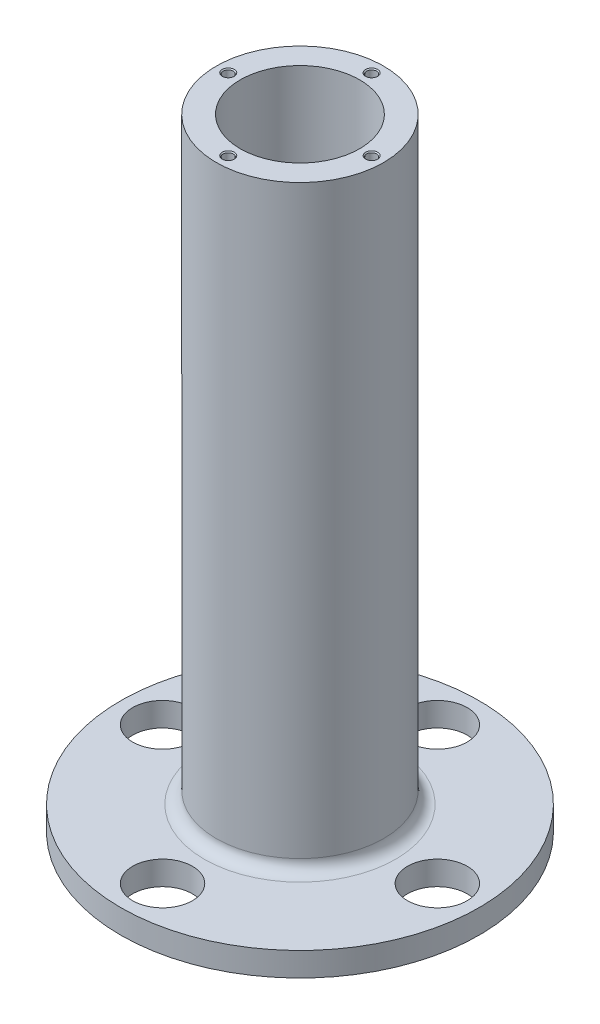
ISO-10303-21;
HEADER;
FILE_DESCRIPTION(('STEP AP214'),'2;1');
FILE_NAME('part.step','',(''),(''),'','','');
FILE_SCHEMA(('AUTOMOTIVE_DESIGN { 1 0 10303 214 1 1 1 1 }'));
ENDSEC;
DATA;
#1=APPLICATION_CONTEXT('core data for automotive mechanical design processes');
#2=APPLICATION_PROTOCOL_DEFINITION('international standard','automotive_design',2000,#1);
#3=PRODUCT_CONTEXT('',#1,'mechanical');
#4=PRODUCT('Part','Part','',(#3));
#5=PRODUCT_RELATED_PRODUCT_CATEGORY('part','',(#4));
#6=PRODUCT_DEFINITION_FORMATION('','',#4);
#7=PRODUCT_DEFINITION_CONTEXT('part definition',#1,'design');
#8=PRODUCT_DEFINITION('design','',#6,#7);
#9=PRODUCT_DEFINITION_SHAPE('','',#8);
#10=(LENGTH_UNIT() NAMED_UNIT(*) SI_UNIT(.MILLI.,.METRE.));
#11=(NAMED_UNIT(*) PLANE_ANGLE_UNIT() SI_UNIT($,.RADIAN.));
#12=(NAMED_UNIT(*) SI_UNIT($,.STERADIAN.) SOLID_ANGLE_UNIT());
#13=UNCERTAINTY_MEASURE_WITH_UNIT(LENGTH_MEASURE(1.E-05),#10,'distance_accuracy_value','');
#14=(GEOMETRIC_REPRESENTATION_CONTEXT(3) GLOBAL_UNCERTAINTY_ASSIGNED_CONTEXT((#13)) GLOBAL_UNIT_ASSIGNED_CONTEXT((#10,
#11,#12)) REPRESENTATION_CONTEXT('',''));
#15=CARTESIAN_POINT('',(0.,0.,0.));
#16=DIRECTION('',(0.,0.,1.));
#17=DIRECTION('',(1.,0.,0.));
#18=AXIS2_PLACEMENT_3D('',#15,#16,#17);
#19=CARTESIAN_POINT('',(0.,10.,0.));
#20=DIRECTION('',(0.,-1.,0.));
#21=DIRECTION('',(0.,0.,-1.));
#22=AXIS2_PLACEMENT_3D('',#19,#20,#21);
#23=CYLINDRICAL_SURFACE('',#22,75.);
#24=CARTESIAN_POINT('',(0.,10.,0.));
#25=DIRECTION('',(0.,1.,0.));
#26=DIRECTION('',(0.,0.,1.));
#27=AXIS2_PLACEMENT_3D('',#24,#25,#26);
#28=CIRCLE('',#27,75.);
#29=CARTESIAN_POINT('',(0.,10.,75.));
#30=VERTEX_POINT('',#29);
#31=EDGE_CURVE('E147',#30,#30,#28,.T.);
#32=ORIENTED_EDGE('',*,*,#31,.F.);
#33=EDGE_LOOP('',(#32));
#34=FACE_BOUND('',#33,.T.);
#35=CARTESIAN_POINT('',(0.,0.,0.));
#36=DIRECTION('',(0.,1.,0.));
#37=DIRECTION('',(0.,0.,1.));
#38=AXIS2_PLACEMENT_3D('',#35,#36,#37);
#39=CIRCLE('',#38,75.);
#40=CARTESIAN_POINT('',(0.,0.,75.));
#41=VERTEX_POINT('',#40);
#42=EDGE_CURVE('E146',#41,#41,#39,.T.);
#43=ORIENTED_EDGE('',*,*,#42,.T.);
#44=EDGE_LOOP('',(#43));
#45=FACE_BOUND('',#44,.T.);
#46=ADVANCED_FACE('F51',(#34,#45),#23,.T.);
#47=CARTESIAN_POINT('',(0.,10.,0.));
#48=DIRECTION('',(0.,1.,0.));
#49=DIRECTION('',(0.,0.,1.));
#50=AXIS2_PLACEMENT_3D('',#47,#48,#49);
#51=PLANE('',#50);
#52=CARTESIAN_POINT('',(0.,10.,0.));
#53=DIRECTION('',(0.,1.,0.));
#54=DIRECTION('',(0.,0.,1.));
#55=AXIS2_PLACEMENT_3D('',#52,#53,#54);
#56=CIRCLE('',#55,40.);
#57=CARTESIAN_POINT('',(0.,10.,40.));
#58=VERTEX_POINT('',#57);
#59=EDGE_CURVE('E12',#58,#58,#56,.F.);
#60=ORIENTED_EDGE('',*,*,#59,.T.);
#61=EDGE_LOOP('',(#60));
#62=FACE_BOUND('',#61,.T.);
#63=CARTESIAN_POINT('',(57.5,10.,0.));
#64=DIRECTION('',(0.,1.,0.));
#65=DIRECTION('',(0.,0.,1.));
#66=AXIS2_PLACEMENT_3D('',#63,#64,#65);
#67=CIRCLE('',#66,12.5);
#68=CARTESIAN_POINT('',(57.5,10.,12.5));
#69=VERTEX_POINT('',#68);
#70=EDGE_CURVE('E116',#69,#69,#67,.T.);
#71=ORIENTED_EDGE('',*,*,#70,.F.);
#72=EDGE_LOOP('',(#71));
#73=FACE_BOUND('',#72,.T.);
#74=CARTESIAN_POINT('',(-2.0076017698348E-13,10.,57.5));
#75=DIRECTION('',(0.,1.,0.));
#76=DIRECTION('',(0.,0.,1.));
#77=AXIS2_PLACEMENT_3D('',#74,#75,#76);
#78=CIRCLE('',#77,12.5);
#79=CARTESIAN_POINT('',(-2.0076017698348E-13,10.,70.));
#80=VERTEX_POINT('',#79);
#81=EDGE_CURVE('E122',#80,#80,#78,.T.);
#82=ORIENTED_EDGE('',*,*,#81,.F.);
#83=EDGE_LOOP('',(#82));
#84=FACE_BOUND('',#83,.T.);
#85=CARTESIAN_POINT('',(-57.5,10.,-4.0152035396696E-13));
#86=DIRECTION('',(0.,1.,0.));
#87=DIRECTION('',(0.,0.,1.));
#88=AXIS2_PLACEMENT_3D('',#85,#86,#87);
#89=CIRCLE('',#88,12.5);
#90=CARTESIAN_POINT('',(-57.5,10.,12.4999999999996));
#91=VERTEX_POINT('',#90);
#92=EDGE_CURVE('E128',#91,#91,#89,.T.);
#93=ORIENTED_EDGE('',*,*,#92,.F.);
#94=EDGE_LOOP('',(#93));
#95=FACE_BOUND('',#94,.T.);
#96=CARTESIAN_POINT('',(6.0228053095044E-13,10.,-57.5));
#97=DIRECTION('',(0.,1.,0.));
#98=DIRECTION('',(0.,0.,1.));
#99=AXIS2_PLACEMENT_3D('',#96,#97,#98);
#100=CIRCLE('',#99,12.5);
#101=CARTESIAN_POINT('',(6.0228053095044E-13,10.,-45.));
#102=VERTEX_POINT('',#101);
#103=EDGE_CURVE('E134',#102,#102,#100,.T.);
#104=ORIENTED_EDGE('',*,*,#103,.F.);
#105=EDGE_LOOP('',(#104));
#106=FACE_BOUND('',#105,.T.);
#107=ORIENTED_EDGE('',*,*,#31,.T.);
#108=EDGE_LOOP('',(#107));
#109=FACE_BOUND('',#108,.T.);
#110=ADVANCED_FACE('F171',(#62,#73,#84,#95,#106,#109),#51,.T.);
#111=CARTESIAN_POINT('',(0.,0.,0.));
#112=DIRECTION('',(0.,1.,0.));
#113=DIRECTION('',(0.,0.,1.));
#114=AXIS2_PLACEMENT_3D('',#111,#112,#113);
#115=PLANE('',#114);
#116=CARTESIAN_POINT('',(57.5,0.,0.));
#117=DIRECTION('',(0.,1.,0.));
#118=DIRECTION('',(0.,0.,1.));
#119=AXIS2_PLACEMENT_3D('',#116,#117,#118);
#120=CIRCLE('',#119,12.5);
#121=CARTESIAN_POINT('',(57.5,0.,12.5));
#122=VERTEX_POINT('',#121);
#123=EDGE_CURVE('E119',#122,#122,#120,.T.);
#124=ORIENTED_EDGE('',*,*,#123,.T.);
#125=EDGE_LOOP('',(#124));
#126=FACE_BOUND('',#125,.T.);
#127=CARTESIAN_POINT('',(-2.0076017698348E-13,0.,57.5));
#128=DIRECTION('',(0.,1.,0.));
#129=DIRECTION('',(0.,0.,1.));
#130=AXIS2_PLACEMENT_3D('',#127,#128,#129);
#131=CIRCLE('',#130,12.5);
#132=CARTESIAN_POINT('',(-2.0076017698348E-13,0.,70.));
#133=VERTEX_POINT('',#132);
#134=EDGE_CURVE('E125',#133,#133,#131,.T.);
#135=ORIENTED_EDGE('',*,*,#134,.T.);
#136=EDGE_LOOP('',(#135));
#137=FACE_BOUND('',#136,.T.);
#138=CARTESIAN_POINT('',(-57.5,0.,-4.0152035396696E-13));
#139=DIRECTION('',(0.,1.,0.));
#140=DIRECTION('',(0.,0.,1.));
#141=AXIS2_PLACEMENT_3D('',#138,#139,#140);
#142=CIRCLE('',#141,12.5);
#143=CARTESIAN_POINT('',(-57.5,0.,12.4999999999996));
#144=VERTEX_POINT('',#143);
#145=EDGE_CURVE('E131',#144,#144,#142,.T.);
#146=ORIENTED_EDGE('',*,*,#145,.T.);
#147=EDGE_LOOP('',(#146));
#148=FACE_BOUND('',#147,.T.);
#149=CARTESIAN_POINT('',(6.0228053095044E-13,0.,-57.5));
#150=DIRECTION('',(0.,1.,0.));
#151=DIRECTION('',(0.,0.,1.));
#152=AXIS2_PLACEMENT_3D('',#149,#150,#151);
#153=CIRCLE('',#152,12.5);
#154=CARTESIAN_POINT('',(6.0228053095044E-13,0.,-45.));
#155=VERTEX_POINT('',#154);
#156=EDGE_CURVE('E137',#155,#155,#153,.T.);
#157=ORIENTED_EDGE('',*,*,#156,.T.);
#158=EDGE_LOOP('',(#157));
#159=FACE_BOUND('',#158,.T.);
#160=ORIENTED_EDGE('',*,*,#42,.F.);
#161=EDGE_LOOP('',(#160));
#162=FACE_BOUND('',#161,.T.);
#163=ADVANCED_FACE('F177',(#126,#137,#148,#159,#162),#115,.F.);
#164=CARTESIAN_POINT('',(0.,260.,0.));
#165=DIRECTION('',(0.,1.,0.));
#166=DIRECTION('',(0.,0.,1.));
#167=AXIS2_PLACEMENT_3D('',#164,#165,#166);
#168=PLANE('',#167);
#169=CARTESIAN_POINT('',(-30.,260.,0.));
#170=DIRECTION('',(0.,1.,0.));
#171=DIRECTION('',(0.,0.,1.));
#172=AXIS2_PLACEMENT_3D('',#169,#170,#171);
#173=CIRCLE('',#172,2.525);
#174=CARTESIAN_POINT('',(-30.,260.,2.525));
#175=VERTEX_POINT('',#174);
#176=EDGE_CURVE('E89',#175,#175,#173,.T.);
#177=ORIENTED_EDGE('',*,*,#176,.F.);
#178=EDGE_LOOP('',(#177));
#179=FACE_BOUND('',#178,.T.);
#180=CARTESIAN_POINT('',(1.04744440165294E-13,260.,-30.));
#181=DIRECTION('',(0.,1.,0.));
#182=DIRECTION('',(0.,0.,1.));
#183=AXIS2_PLACEMENT_3D('',#180,#181,#182);
#184=CIRCLE('',#183,2.525);
#185=CARTESIAN_POINT('',(1.04744440165294E-13,260.,-27.475));
#186=VERTEX_POINT('',#185);
#187=EDGE_CURVE('E82',#186,#186,#184,.T.);
#188=ORIENTED_EDGE('',*,*,#187,.F.);
#189=EDGE_LOOP('',(#188));
#190=FACE_BOUND('',#189,.T.);
#191=CARTESIAN_POINT('',(30.,260.,2.09488880330588E-13));
#192=DIRECTION('',(0.,1.,0.));
#193=DIRECTION('',(0.,0.,1.));
#194=AXIS2_PLACEMENT_3D('',#191,#192,#193);
#195=CIRCLE('',#194,2.525);
#196=CARTESIAN_POINT('',(30.,260.,2.52500000000021));
#197=VERTEX_POINT('',#196);
#198=EDGE_CURVE('E98',#197,#197,#195,.T.);
#199=ORIENTED_EDGE('',*,*,#198,.F.);
#200=EDGE_LOOP('',(#199));
#201=FACE_BOUND('',#200,.T.);
#202=CARTESIAN_POINT('',(-3.14233320495882E-13,260.,30.));
#203=DIRECTION('',(0.,1.,0.));
#204=DIRECTION('',(0.,0.,1.));
#205=AXIS2_PLACEMENT_3D('',#202,#203,#204);
#206=CIRCLE('',#205,2.525);
#207=CARTESIAN_POINT('',(-3.14233320495882E-13,260.,32.525));
#208=VERTEX_POINT('',#207);
#209=EDGE_CURVE('E107',#208,#208,#206,.T.);
#210=ORIENTED_EDGE('',*,*,#209,.F.);
#211=EDGE_LOOP('',(#210));
#212=FACE_BOUND('',#211,.T.);
#213=CARTESIAN_POINT('',(0.,260.,0.));
#214=DIRECTION('',(0.,1.,0.));
#215=DIRECTION('',(1.,0.,0.));
#216=AXIS2_PLACEMENT_3D('',#213,#214,#215);
#217=CIRCLE('',#216,35.);
#218=CARTESIAN_POINT('',(35.,260.,0.));
#219=VERTEX_POINT('',#218);
#220=EDGE_CURVE('E143',#219,#219,#217,.T.);
#221=ORIENTED_EDGE('',*,*,#220,.T.);
#222=EDGE_LOOP('',(#221));
#223=FACE_BOUND('',#222,.T.);
#224=CARTESIAN_POINT('',(0.,260.,0.));
#225=DIRECTION('',(0.,1.,0.));
#226=DIRECTION('',(0.,0.,1.));
#227=AXIS2_PLACEMENT_3D('',#224,#225,#226);
#228=CIRCLE('',#227,25.);
#229=CARTESIAN_POINT('',(0.,260.,25.));
#230=VERTEX_POINT('',#229);
#231=EDGE_CURVE('E140',#230,#230,#228,.T.);
#232=ORIENTED_EDGE('',*,*,#231,.F.);
#233=EDGE_LOOP('',(#232));
#234=FACE_BOUND('',#233,.T.);
#235=ADVANCED_FACE('F185',(#179,#190,#201,#212,#223,#234),#168,.T.);
#236=CARTESIAN_POINT('',(0.,260.,0.));
#237=DIRECTION('',(0.,-1.,0.));
#238=DIRECTION('',(0.,0.,-1.));
#239=AXIS2_PLACEMENT_3D('',#236,#237,#238);
#240=CYLINDRICAL_SURFACE('',#239,35.);
#241=CARTESIAN_POINT('',(0.,15.,0.));
#242=DIRECTION('',(0.,1.,0.));
#243=DIRECTION('',(0.,0.,1.));
#244=AXIS2_PLACEMENT_3D('',#241,#242,#243);
#245=CIRCLE('',#244,35.);
#246=CARTESIAN_POINT('',(0.,15.,35.));
#247=VERTEX_POINT('',#246);
#248=EDGE_CURVE('E59',#247,#247,#245,.T.);
#249=ORIENTED_EDGE('',*,*,#248,.T.);
#250=EDGE_LOOP('',(#249));
#251=FACE_BOUND('',#250,.T.);
#252=ORIENTED_EDGE('',*,*,#220,.F.);
#253=EDGE_LOOP('',(#252));
#254=FACE_BOUND('',#253,.T.);
#255=ADVANCED_FACE('F157',(#251,#254),#240,.T.);
#256=CARTESIAN_POINT('',(0.,260.,0.));
#257=DIRECTION('',(0.,-1.,0.));
#258=DIRECTION('',(0.,0.,-1.));
#259=AXIS2_PLACEMENT_3D('',#256,#257,#258);
#260=CYLINDRICAL_SURFACE('',#259,25.);
#261=ORIENTED_EDGE('',*,*,#231,.T.);
#262=EDGE_LOOP('',(#261));
#263=FACE_BOUND('',#262,.T.);
#264=CARTESIAN_POINT('',(0.,10.,0.));
#265=DIRECTION('',(0.,1.,0.));
#266=DIRECTION('',(0.,0.,1.));
#267=AXIS2_PLACEMENT_3D('',#264,#265,#266);
#268=CIRCLE('',#267,25.);
#269=CARTESIAN_POINT('',(0.,10.,25.));
#270=VERTEX_POINT('',#269);
#271=EDGE_CURVE('E150',#270,#270,#268,.F.);
#272=ORIENTED_EDGE('',*,*,#271,.T.);
#273=EDGE_LOOP('',(#272));
#274=FACE_BOUND('',#273,.T.);
#275=ADVANCED_FACE('F189',(#263,#274),#260,.F.);
#276=ORIENTED_EDGE('',*,*,#271,.F.);
#277=EDGE_LOOP('',(#276));
#278=FACE_BOUND('',#277,.T.);
#279=ADVANCED_FACE('F180',(#278),#51,.T.);
#280=CARTESIAN_POINT('',(6.0228053095044E-13,10.,-57.5));
#281=DIRECTION('',(0.,1.,0.));
#282=DIRECTION('',(0.,0.,1.));
#283=AXIS2_PLACEMENT_3D('',#280,#281,#282);
#284=CYLINDRICAL_SURFACE('',#283,12.5);
#285=ORIENTED_EDGE('',*,*,#156,.F.);
#286=EDGE_LOOP('',(#285));
#287=FACE_BOUND('',#286,.T.);
#288=ORIENTED_EDGE('',*,*,#103,.T.);
#289=EDGE_LOOP('',(#288));
#290=FACE_BOUND('',#289,.T.);
#291=ADVANCED_FACE('F195',(#287,#290),#284,.F.);
#292=CARTESIAN_POINT('',(-57.5,10.,-4.0152035396696E-13));
#293=DIRECTION('',(0.,1.,0.));
#294=DIRECTION('',(0.,0.,1.));
#295=AXIS2_PLACEMENT_3D('',#292,#293,#294);
#296=CYLINDRICAL_SURFACE('',#295,12.5);
#297=ORIENTED_EDGE('',*,*,#145,.F.);
#298=EDGE_LOOP('',(#297));
#299=FACE_BOUND('',#298,.T.);
#300=ORIENTED_EDGE('',*,*,#92,.T.);
#301=EDGE_LOOP('',(#300));
#302=FACE_BOUND('',#301,.T.);
#303=ADVANCED_FACE('F198',(#299,#302),#296,.F.);
#304=CARTESIAN_POINT('',(-2.0076017698348E-13,10.,57.5));
#305=DIRECTION('',(0.,1.,0.));
#306=DIRECTION('',(0.,0.,1.));
#307=AXIS2_PLACEMENT_3D('',#304,#305,#306);
#308=CYLINDRICAL_SURFACE('',#307,12.5);
#309=ORIENTED_EDGE('',*,*,#134,.F.);
#310=EDGE_LOOP('',(#309));
#311=FACE_BOUND('',#310,.T.);
#312=ORIENTED_EDGE('',*,*,#81,.T.);
#313=EDGE_LOOP('',(#312));
#314=FACE_BOUND('',#313,.T.);
#315=ADVANCED_FACE('F202',(#311,#314),#308,.F.);
#316=CARTESIAN_POINT('',(57.5,10.,0.));
#317=DIRECTION('',(0.,1.,0.));
#318=DIRECTION('',(0.,0.,1.));
#319=AXIS2_PLACEMENT_3D('',#316,#317,#318);
#320=CYLINDRICAL_SURFACE('',#319,12.5);
#321=ORIENTED_EDGE('',*,*,#123,.F.);
#322=EDGE_LOOP('',(#321));
#323=FACE_BOUND('',#322,.T.);
#324=ORIENTED_EDGE('',*,*,#70,.T.);
#325=EDGE_LOOP('',(#324));
#326=FACE_BOUND('',#325,.T.);
#327=ADVANCED_FACE('F206',(#323,#326),#320,.F.);
#328=CARTESIAN_POINT('',(-3.14233320495882E-13,237.6,30.));
#329=DIRECTION('',(0.,1.,0.));
#330=DIRECTION('',(0.,0.,1.));
#331=AXIS2_PLACEMENT_3D('',#328,#329,#330);
#332=CONICAL_SURFACE('',#331,2.09999999999999,1.02974425867665);
#333=CARTESIAN_POINT('',(-3.20028791810269E-13,236.338192700042,30.));
#334=VERTEX_POINT('',#333);
#335=VERTEX_LOOP('',#334);
#336=FACE_BOUND('',#335,.T.);
#337=CARTESIAN_POINT('',(-3.14233320495882E-13,237.6,30.));
#338=DIRECTION('',(0.,1.,0.));
#339=DIRECTION('',(0.,0.,1.));
#340=AXIS2_PLACEMENT_3D('',#337,#338,#339);
#341=CIRCLE('',#340,2.09999999999999);
#342=CARTESIAN_POINT('',(-3.14233320495882E-13,237.6,32.1));
#343=VERTEX_POINT('',#342);
#344=EDGE_CURVE('E113',#343,#343,#341,.T.);
#345=ORIENTED_EDGE('',*,*,#344,.T.);
#346=EDGE_LOOP('',(#345));
#347=FACE_BOUND('',#346,.T.);
#348=ADVANCED_FACE('F210',(#336,#347),#332,.F.);
#349=CARTESIAN_POINT('',(-3.14233320495882E-13,260.,30.));
#350=DIRECTION('',(0.,1.,0.));
#351=DIRECTION('',(0.,0.,1.));
#352=AXIS2_PLACEMENT_3D('',#349,#350,#351);
#353=CYLINDRICAL_SURFACE('',#352,2.09999999999999);
#354=ORIENTED_EDGE('',*,*,#344,.F.);
#355=EDGE_LOOP('',(#354));
#356=FACE_BOUND('',#355,.T.);
#357=CARTESIAN_POINT('',(-3.14233320495882E-13,259.575,30.));
#358=DIRECTION('',(0.,1.,0.));
#359=DIRECTION('',(0.,0.,1.));
#360=AXIS2_PLACEMENT_3D('',#357,#358,#359);
#361=CIRCLE('',#360,2.1);
#362=CARTESIAN_POINT('',(-3.14233320495882E-13,259.575,32.1));
#363=VERTEX_POINT('',#362);
#364=EDGE_CURVE('E110',#363,#363,#361,.T.);
#365=ORIENTED_EDGE('',*,*,#364,.T.);
#366=EDGE_LOOP('',(#365));
#367=FACE_BOUND('',#366,.T.);
#368=ADVANCED_FACE('F214',(#356,#367),#353,.F.);
#369=CARTESIAN_POINT('',(-3.14233320495882E-13,260.,30.));
#370=DIRECTION('',(0.,1.,0.));
#371=DIRECTION('',(0.,0.,1.));
#372=AXIS2_PLACEMENT_3D('',#369,#370,#371);
#373=CONICAL_SURFACE('',#372,2.525,0.78539816339744);
#374=ORIENTED_EDGE('',*,*,#364,.F.);
#375=EDGE_LOOP('',(#374));
#376=FACE_BOUND('',#375,.T.);
#377=ORIENTED_EDGE('',*,*,#209,.T.);
#378=EDGE_LOOP('',(#377));
#379=FACE_BOUND('',#378,.T.);
#380=ADVANCED_FACE('F217',(#376,#379),#373,.F.);
#381=CARTESIAN_POINT('',(30.,237.6,2.09488880330588E-13));
#382=DIRECTION('',(0.,1.,0.));
#383=DIRECTION('',(0.,0.,1.));
#384=AXIS2_PLACEMENT_3D('',#381,#382,#383);
#385=CONICAL_SURFACE('',#384,2.09999999999998,1.02974425867665);
#386=CARTESIAN_POINT('',(30.,236.338192700042,2.09488880330588E-13));
#387=VERTEX_POINT('',#386);
#388=VERTEX_LOOP('',#387);
#389=FACE_BOUND('',#388,.T.);
#390=CARTESIAN_POINT('',(30.,237.6,2.09488880330588E-13));
#391=DIRECTION('',(0.,1.,0.));
#392=DIRECTION('',(0.,0.,1.));
#393=AXIS2_PLACEMENT_3D('',#390,#391,#392);
#394=CIRCLE('',#393,2.09999999999998);
#395=CARTESIAN_POINT('',(30.,237.6,2.10000000000019));
#396=VERTEX_POINT('',#395);
#397=EDGE_CURVE('E104',#396,#396,#394,.T.);
#398=ORIENTED_EDGE('',*,*,#397,.T.);
#399=EDGE_LOOP('',(#398));
#400=FACE_BOUND('',#399,.T.);
#401=ADVANCED_FACE('F221',(#389,#400),#385,.F.);
#402=CARTESIAN_POINT('',(30.,260.,2.09488880330588E-13));
#403=DIRECTION('',(0.,1.,0.));
#404=DIRECTION('',(0.,0.,1.));
#405=AXIS2_PLACEMENT_3D('',#402,#403,#404);
#406=CYLINDRICAL_SURFACE('',#405,2.09999999999999);
#407=ORIENTED_EDGE('',*,*,#397,.F.);
#408=EDGE_LOOP('',(#407));
#409=FACE_BOUND('',#408,.T.);
#410=CARTESIAN_POINT('',(30.,259.575,2.09488880330588E-13));
#411=DIRECTION('',(0.,1.,0.));
#412=DIRECTION('',(0.,0.,1.));
#413=AXIS2_PLACEMENT_3D('',#410,#411,#412);
#414=CIRCLE('',#413,2.1);
#415=CARTESIAN_POINT('',(30.,259.575,2.10000000000021));
#416=VERTEX_POINT('',#415);
#417=EDGE_CURVE('E101',#416,#416,#414,.T.);
#418=ORIENTED_EDGE('',*,*,#417,.T.);
#419=EDGE_LOOP('',(#418));
#420=FACE_BOUND('',#419,.T.);
#421=ADVANCED_FACE('F225',(#409,#420),#406,.F.);
#422=CARTESIAN_POINT('',(30.,260.,2.09488880330588E-13));
#423=DIRECTION('',(0.,1.,0.));
#424=DIRECTION('',(0.,0.,1.));
#425=AXIS2_PLACEMENT_3D('',#422,#423,#424);
#426=CONICAL_SURFACE('',#425,2.525,0.78539816339744);
#427=ORIENTED_EDGE('',*,*,#417,.F.);
#428=EDGE_LOOP('',(#427));
#429=FACE_BOUND('',#428,.T.);
#430=ORIENTED_EDGE('',*,*,#198,.T.);
#431=EDGE_LOOP('',(#430));
#432=FACE_BOUND('',#431,.T.);
#433=ADVANCED_FACE('F228',(#429,#432),#426,.F.);
#434=CARTESIAN_POINT('',(1.04744440165294E-13,237.6,-30.));
#435=DIRECTION('',(0.,1.,0.));
#436=DIRECTION('',(0.,0.,1.));
#437=AXIS2_PLACEMENT_3D('',#434,#435,#436);
#438=CONICAL_SURFACE('',#437,2.09999999999999,1.02974425867665);
#439=CARTESIAN_POINT('',(0.,236.338192700042,-30.));
#440=VERTEX_POINT('',#439);
#441=VERTEX_LOOP('',#440);
#442=FACE_BOUND('',#441,.T.);
#443=CARTESIAN_POINT('',(1.04744440165294E-13,237.6,-30.));
#444=DIRECTION('',(0.,1.,0.));
#445=DIRECTION('',(0.,0.,1.));
#446=AXIS2_PLACEMENT_3D('',#443,#444,#445);
#447=CIRCLE('',#446,2.09999999999999);
#448=CARTESIAN_POINT('',(1.04744440165294E-13,237.6,-27.9));
#449=VERTEX_POINT('',#448);
#450=EDGE_CURVE('E95',#449,#449,#447,.T.);
#451=ORIENTED_EDGE('',*,*,#450,.T.);
#452=EDGE_LOOP('',(#451));
#453=FACE_BOUND('',#452,.T.);
#454=ADVANCED_FACE('F232',(#442,#453),#438,.F.);
#455=CARTESIAN_POINT('',(1.04744440165294E-13,260.,-30.));
#456=DIRECTION('',(0.,1.,0.));
#457=DIRECTION('',(0.,0.,1.));
#458=AXIS2_PLACEMENT_3D('',#455,#456,#457);
#459=CYLINDRICAL_SURFACE('',#458,2.09999999999999);
#460=ORIENTED_EDGE('',*,*,#450,.F.);
#461=EDGE_LOOP('',(#460));
#462=FACE_BOUND('',#461,.T.);
#463=CARTESIAN_POINT('',(1.04744440165294E-13,259.575,-30.));
#464=DIRECTION('',(0.,1.,0.));
#465=DIRECTION('',(0.,0.,1.));
#466=AXIS2_PLACEMENT_3D('',#463,#464,#465);
#467=CIRCLE('',#466,2.1);
#468=CARTESIAN_POINT('',(1.04744440165294E-13,259.575,-27.9));
#469=VERTEX_POINT('',#468);
#470=EDGE_CURVE('E86',#469,#469,#467,.T.);
#471=ORIENTED_EDGE('',*,*,#470,.T.);
#472=EDGE_LOOP('',(#471));
#473=FACE_BOUND('',#472,.T.);
#474=ADVANCED_FACE('F236',(#462,#473),#459,.F.);
#475=CARTESIAN_POINT('',(1.04744440165294E-13,260.,-30.));
#476=DIRECTION('',(0.,1.,0.));
#477=DIRECTION('',(0.,0.,1.));
#478=AXIS2_PLACEMENT_3D('',#475,#476,#477);
#479=CONICAL_SURFACE('',#478,2.525,0.78539816339744);
#480=ORIENTED_EDGE('',*,*,#470,.F.);
#481=EDGE_LOOP('',(#480));
#482=FACE_BOUND('',#481,.T.);
#483=ORIENTED_EDGE('',*,*,#187,.T.);
#484=EDGE_LOOP('',(#483));
#485=FACE_BOUND('',#484,.T.);
#486=ADVANCED_FACE('F76',(#482,#485),#479,.F.);
#487=CARTESIAN_POINT('',(-30.,237.6,0.));
#488=DIRECTION('',(0.,1.,0.));
#489=DIRECTION('',(0.,0.,1.));
#490=AXIS2_PLACEMENT_3D('',#487,#488,#489);
#491=CONICAL_SURFACE('',#490,2.09999999999998,1.02974425867665);
#492=CARTESIAN_POINT('',(-30.,236.338192700042,0.));
#493=VERTEX_POINT('',#492);
#494=VERTEX_LOOP('',#493);
#495=FACE_BOUND('',#494,.T.);
#496=CARTESIAN_POINT('',(-30.,237.6,0.));
#497=DIRECTION('',(0.,1.,0.));
#498=DIRECTION('',(0.,0.,1.));
#499=AXIS2_PLACEMENT_3D('',#496,#497,#498);
#500=CIRCLE('',#499,2.09999999999998);
#501=CARTESIAN_POINT('',(-30.,237.6,2.09999999999998));
#502=VERTEX_POINT('',#501);
#503=EDGE_CURVE('E80',#502,#502,#500,.T.);
#504=ORIENTED_EDGE('',*,*,#503,.T.);
#505=EDGE_LOOP('',(#504));
#506=FACE_BOUND('',#505,.T.);
#507=ADVANCED_FACE('F72',(#495,#506),#491,.F.);
#508=CARTESIAN_POINT('',(-30.,260.,0.));
#509=DIRECTION('',(0.,1.,0.));
#510=DIRECTION('',(0.,0.,1.));
#511=AXIS2_PLACEMENT_3D('',#508,#509,#510);
#512=CYLINDRICAL_SURFACE('',#511,2.09999999999999);
#513=ORIENTED_EDGE('',*,*,#503,.F.);
#514=EDGE_LOOP('',(#513));
#515=FACE_BOUND('',#514,.T.);
#516=CARTESIAN_POINT('',(-30.,259.575,0.));
#517=DIRECTION('',(0.,1.,0.));
#518=DIRECTION('',(0.,0.,1.));
#519=AXIS2_PLACEMENT_3D('',#516,#517,#518);
#520=CIRCLE('',#519,2.1);
#521=CARTESIAN_POINT('',(-30.,259.575,2.1));
#522=VERTEX_POINT('',#521);
#523=EDGE_CURVE('E83',#522,#522,#520,.T.);
#524=ORIENTED_EDGE('',*,*,#523,.T.);
#525=EDGE_LOOP('',(#524));
#526=FACE_BOUND('',#525,.T.);
#527=ADVANCED_FACE('F75',(#515,#526),#512,.F.);
#528=CARTESIAN_POINT('',(-30.,260.,0.));
#529=DIRECTION('',(0.,1.,0.));
#530=DIRECTION('',(0.,0.,1.));
#531=AXIS2_PLACEMENT_3D('',#528,#529,#530);
#532=CONICAL_SURFACE('',#531,2.525,0.78539816339744);
#533=ORIENTED_EDGE('',*,*,#523,.F.);
#534=EDGE_LOOP('',(#533));
#535=FACE_BOUND('',#534,.T.);
#536=ORIENTED_EDGE('',*,*,#176,.T.);
#537=EDGE_LOOP('',(#536));
#538=FACE_BOUND('',#537,.T.);
#539=ADVANCED_FACE('F161',(#535,#538),#532,.F.);
#540=CARTESIAN_POINT('',(0.,15.,0.));
#541=DIRECTION('',(0.,1.,0.));
#542=DIRECTION('',(0.,0.,1.));
#543=AXIS2_PLACEMENT_3D('',#540,#541,#542);
#544=TOROIDAL_SURFACE('',#543,40.,5.);
#545=ORIENTED_EDGE('',*,*,#59,.F.);
#546=EDGE_LOOP('',(#545));
#547=FACE_BOUND('',#546,.T.);
#548=ORIENTED_EDGE('',*,*,#248,.F.);
#549=EDGE_LOOP('',(#548));
#550=FACE_BOUND('',#549,.T.);
#551=ADVANCED_FACE('F53',(#547,#550),#544,.F.);
#552=CLOSED_SHELL('',(#46,#110,#163,#235,#255,#275,#279,#291,#303,#315,#327,#348,#368,#380,#401,
#421,#433,#454,#474,#486,#507,#527,#539,#551));
#553=MANIFOLD_SOLID_BREP('B2',#552);
#554=ADVANCED_BREP_SHAPE_REPRESENTATION('',(#18,#553),#14);
#555=SHAPE_DEFINITION_REPRESENTATION(#9,#554);
ENDSEC;
END-ISO-10303-21;
